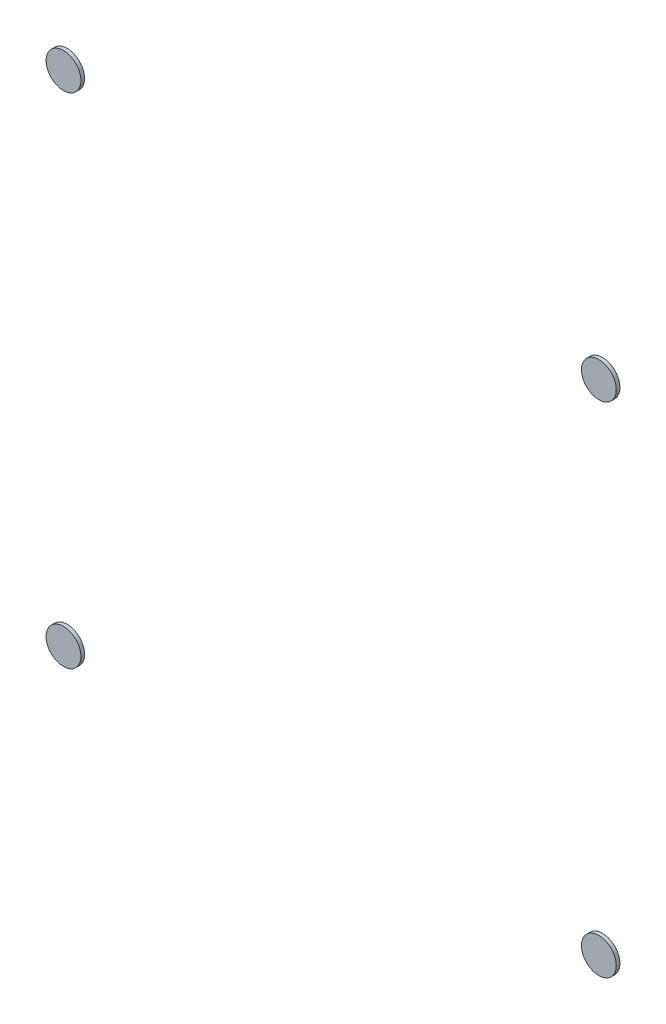
ISO-10303-21;
HEADER;
FILE_DESCRIPTION(('STEP AP214'),'2;1');
FILE_NAME('part.step','',(''),(''),'','','');
FILE_SCHEMA(('AUTOMOTIVE_DESIGN { 1 0 10303 214 1 1 1 1 }'));
ENDSEC;
DATA;
#1=APPLICATION_CONTEXT('core data for automotive mechanical design processes');
#2=APPLICATION_PROTOCOL_DEFINITION('international standard','automotive_design',2000,#1);
#3=PRODUCT_CONTEXT('',#1,'mechanical');
#4=PRODUCT('Part','Part','',(#3));
#5=PRODUCT_RELATED_PRODUCT_CATEGORY('part','',(#4));
#6=PRODUCT_DEFINITION_FORMATION('','',#4);
#7=PRODUCT_DEFINITION_CONTEXT('part definition',#1,'design');
#8=PRODUCT_DEFINITION('design','',#6,#7);
#9=PRODUCT_DEFINITION_SHAPE('','',#8);
#10=(LENGTH_UNIT() NAMED_UNIT(*) SI_UNIT(.MILLI.,.METRE.));
#11=(NAMED_UNIT(*) PLANE_ANGLE_UNIT() SI_UNIT($,.RADIAN.));
#12=(NAMED_UNIT(*) SI_UNIT($,.STERADIAN.) SOLID_ANGLE_UNIT());
#13=UNCERTAINTY_MEASURE_WITH_UNIT(LENGTH_MEASURE(1.E-05),#10,'distance_accuracy_value','');
#14=(GEOMETRIC_REPRESENTATION_CONTEXT(3) GLOBAL_UNCERTAINTY_ASSIGNED_CONTEXT((#13)) GLOBAL_UNIT_ASSIGNED_CONTEXT((#10,
#11,#12)) REPRESENTATION_CONTEXT('',''));
#15=CARTESIAN_POINT('',(0.,0.,0.));
#16=DIRECTION('',(0.,0.,1.));
#17=DIRECTION('',(1.,0.,0.));
#18=AXIS2_PLACEMENT_3D('',#15,#16,#17);
#19=CARTESIAN_POINT('',(-146.,-136.,-49.));
#20=DIRECTION('',(0.,0.,1.));
#21=DIRECTION('',(1.,0.,0.));
#22=AXIS2_PLACEMENT_3D('',#19,#20,#21);
#23=PLANE('',#22);
#24=CARTESIAN_POINT('',(-146.,-136.,-49.));
#25=DIRECTION('',(0.,0.,-1.));
#26=DIRECTION('',(-1.,0.,0.));
#27=AXIS2_PLACEMENT_3D('',#24,#25,#26);
#28=CIRCLE('',#27,9.5);
#29=CARTESIAN_POINT('',(-155.5,-136.,-49.));
#30=VERTEX_POINT('',#29);
#31=EDGE_CURVE('P0_E10',#30,#30,#28,.T.);
#32=ORIENTED_EDGE('',*,*,#31,.F.);
#33=EDGE_LOOP('',(#32));
#34=FACE_BOUND('',#33,.T.);
#35=ADVANCED_FACE('P0_F15',(#34),#23,.T.);
#36=CARTESIAN_POINT('',(-146.,-136.,-51.));
#37=DIRECTION('',(0.,0.,-1.));
#38=DIRECTION('',(-1.,0.,0.));
#39=AXIS2_PLACEMENT_3D('',#36,#37,#38);
#40=PLANE('',#39);
#41=CARTESIAN_POINT('',(-146.,-136.,-51.));
#42=DIRECTION('',(0.,0.,1.));
#43=DIRECTION('',(1.,0.,0.));
#44=AXIS2_PLACEMENT_3D('',#41,#42,#43);
#45=CIRCLE('',#44,9.5);
#46=CARTESIAN_POINT('',(-136.5,-136.,-51.));
#47=VERTEX_POINT('',#46);
#48=EDGE_CURVE('P0_E23',#47,#47,#45,.T.);
#49=ORIENTED_EDGE('',*,*,#48,.F.);
#50=EDGE_LOOP('',(#49));
#51=FACE_BOUND('',#50,.T.);
#52=ADVANCED_FACE('P0_F32',(#51),#40,.T.);
#53=CARTESIAN_POINT('',(-146.,-136.,-51.));
#54=DIRECTION('',(0.,0.,1.));
#55=DIRECTION('',(1.,0.,0.));
#56=AXIS2_PLACEMENT_3D('',#53,#54,#55);
#57=CYLINDRICAL_SURFACE('',#56,9.5);
#58=ORIENTED_EDGE('',*,*,#31,.T.);
#59=EDGE_LOOP('',(#58));
#60=FACE_BOUND('',#59,.T.);
#61=ORIENTED_EDGE('',*,*,#48,.T.);
#62=EDGE_LOOP('',(#61));
#63=FACE_BOUND('',#62,.T.);
#64=ADVANCED_FACE('P0_F17',(#60,#63),#57,.T.);
#65=CLOSED_SHELL('',(#35,#52,#64));
#66=MANIFOLD_SOLID_BREP('P0_B1',#65);
#67=CARTESIAN_POINT('',(-146.,136.,-49.));
#68=DIRECTION('',(0.,0.,1.));
#69=DIRECTION('',(1.,0.,0.));
#70=AXIS2_PLACEMENT_3D('',#67,#68,#69);
#71=PLANE('',#70);
#72=CARTESIAN_POINT('',(-146.,136.,-49.));
#73=DIRECTION('',(0.,0.,-1.));
#74=DIRECTION('',(-1.,0.,0.));
#75=AXIS2_PLACEMENT_3D('',#72,#73,#74);
#76=CIRCLE('',#75,9.5);
#77=CARTESIAN_POINT('',(-155.5,136.,-49.));
#78=VERTEX_POINT('',#77);
#79=EDGE_CURVE('P1_E10',#78,#78,#76,.T.);
#80=ORIENTED_EDGE('',*,*,#79,.F.);
#81=EDGE_LOOP('',(#80));
#82=FACE_BOUND('',#81,.T.);
#83=ADVANCED_FACE('P1_F15',(#82),#71,.T.);
#84=CARTESIAN_POINT('',(-146.,136.,-51.));
#85=DIRECTION('',(0.,0.,-1.));
#86=DIRECTION('',(-1.,0.,0.));
#87=AXIS2_PLACEMENT_3D('',#84,#85,#86);
#88=PLANE('',#87);
#89=CARTESIAN_POINT('',(-146.,136.,-51.));
#90=DIRECTION('',(0.,0.,1.));
#91=DIRECTION('',(1.,0.,0.));
#92=AXIS2_PLACEMENT_3D('',#89,#90,#91);
#93=CIRCLE('',#92,9.5);
#94=CARTESIAN_POINT('',(-136.5,136.,-51.));
#95=VERTEX_POINT('',#94);
#96=EDGE_CURVE('P1_E23',#95,#95,#93,.T.);
#97=ORIENTED_EDGE('',*,*,#96,.F.);
#98=EDGE_LOOP('',(#97));
#99=FACE_BOUND('',#98,.T.);
#100=ADVANCED_FACE('P1_F32',(#99),#88,.T.);
#101=CARTESIAN_POINT('',(-146.,136.,-51.));
#102=DIRECTION('',(0.,0.,1.));
#103=DIRECTION('',(1.,0.,0.));
#104=AXIS2_PLACEMENT_3D('',#101,#102,#103);
#105=CYLINDRICAL_SURFACE('',#104,9.5);
#106=ORIENTED_EDGE('',*,*,#79,.T.);
#107=EDGE_LOOP('',(#106));
#108=FACE_BOUND('',#107,.T.);
#109=ORIENTED_EDGE('',*,*,#96,.T.);
#110=EDGE_LOOP('',(#109));
#111=FACE_BOUND('',#110,.T.);
#112=ADVANCED_FACE('P1_F17',(#108,#111),#105,.T.);
#113=CLOSED_SHELL('',(#83,#100,#112));
#114=MANIFOLD_SOLID_BREP('P1_B1',#113);
#115=CARTESIAN_POINT('',(146.,-136.,-49.));
#116=DIRECTION('',(0.,0.,1.));
#117=DIRECTION('',(1.,0.,0.));
#118=AXIS2_PLACEMENT_3D('',#115,#116,#117);
#119=PLANE('',#118);
#120=CARTESIAN_POINT('',(146.,-136.,-49.));
#121=DIRECTION('',(0.,0.,-1.));
#122=DIRECTION('',(-1.,0.,0.));
#123=AXIS2_PLACEMENT_3D('',#120,#121,#122);
#124=CIRCLE('',#123,9.5);
#125=CARTESIAN_POINT('',(136.5,-136.,-49.));
#126=VERTEX_POINT('',#125);
#127=EDGE_CURVE('P2_E10',#126,#126,#124,.T.);
#128=ORIENTED_EDGE('',*,*,#127,.F.);
#129=EDGE_LOOP('',(#128));
#130=FACE_BOUND('',#129,.T.);
#131=ADVANCED_FACE('P2_F15',(#130),#119,.T.);
#132=CARTESIAN_POINT('',(146.,-136.,-51.));
#133=DIRECTION('',(0.,0.,-1.));
#134=DIRECTION('',(-1.,0.,0.));
#135=AXIS2_PLACEMENT_3D('',#132,#133,#134);
#136=PLANE('',#135);
#137=CARTESIAN_POINT('',(146.,-136.,-51.));
#138=DIRECTION('',(0.,0.,1.));
#139=DIRECTION('',(1.,0.,0.));
#140=AXIS2_PLACEMENT_3D('',#137,#138,#139);
#141=CIRCLE('',#140,9.5);
#142=CARTESIAN_POINT('',(155.5,-136.,-51.));
#143=VERTEX_POINT('',#142);
#144=EDGE_CURVE('P2_E23',#143,#143,#141,.T.);
#145=ORIENTED_EDGE('',*,*,#144,.F.);
#146=EDGE_LOOP('',(#145));
#147=FACE_BOUND('',#146,.T.);
#148=ADVANCED_FACE('P2_F32',(#147),#136,.T.);
#149=CARTESIAN_POINT('',(146.,-136.,-51.));
#150=DIRECTION('',(0.,0.,1.));
#151=DIRECTION('',(1.,0.,0.));
#152=AXIS2_PLACEMENT_3D('',#149,#150,#151);
#153=CYLINDRICAL_SURFACE('',#152,9.5);
#154=ORIENTED_EDGE('',*,*,#127,.T.);
#155=EDGE_LOOP('',(#154));
#156=FACE_BOUND('',#155,.T.);
#157=ORIENTED_EDGE('',*,*,#144,.T.);
#158=EDGE_LOOP('',(#157));
#159=FACE_BOUND('',#158,.T.);
#160=ADVANCED_FACE('P2_F17',(#156,#159),#153,.T.);
#161=CLOSED_SHELL('',(#131,#148,#160));
#162=MANIFOLD_SOLID_BREP('P2_B1',#161);
#163=CARTESIAN_POINT('',(146.,136.,-49.));
#164=DIRECTION('',(0.,0.,1.));
#165=DIRECTION('',(1.,0.,0.));
#166=AXIS2_PLACEMENT_3D('',#163,#164,#165);
#167=PLANE('',#166);
#168=CARTESIAN_POINT('',(146.,136.,-49.));
#169=DIRECTION('',(0.,0.,-1.));
#170=DIRECTION('',(-1.,0.,0.));
#171=AXIS2_PLACEMENT_3D('',#168,#169,#170);
#172=CIRCLE('',#171,9.5);
#173=CARTESIAN_POINT('',(136.5,136.,-49.));
#174=VERTEX_POINT('',#173);
#175=EDGE_CURVE('P3_E10',#174,#174,#172,.T.);
#176=ORIENTED_EDGE('',*,*,#175,.F.);
#177=EDGE_LOOP('',(#176));
#178=FACE_BOUND('',#177,.T.);
#179=ADVANCED_FACE('P3_F15',(#178),#167,.T.);
#180=CARTESIAN_POINT('',(146.,136.,-51.));
#181=DIRECTION('',(0.,0.,-1.));
#182=DIRECTION('',(-1.,0.,0.));
#183=AXIS2_PLACEMENT_3D('',#180,#181,#182);
#184=PLANE('',#183);
#185=CARTESIAN_POINT('',(146.,136.,-51.));
#186=DIRECTION('',(0.,0.,1.));
#187=DIRECTION('',(1.,0.,0.));
#188=AXIS2_PLACEMENT_3D('',#185,#186,#187);
#189=CIRCLE('',#188,9.5);
#190=CARTESIAN_POINT('',(155.5,136.,-51.));
#191=VERTEX_POINT('',#190);
#192=EDGE_CURVE('P3_E23',#191,#191,#189,.T.);
#193=ORIENTED_EDGE('',*,*,#192,.F.);
#194=EDGE_LOOP('',(#193));
#195=FACE_BOUND('',#194,.T.);
#196=ADVANCED_FACE('P3_F32',(#195),#184,.T.);
#197=CARTESIAN_POINT('',(146.,136.,-51.));
#198=DIRECTION('',(0.,0.,1.));
#199=DIRECTION('',(1.,0.,0.));
#200=AXIS2_PLACEMENT_3D('',#197,#198,#199);
#201=CYLINDRICAL_SURFACE('',#200,9.5);
#202=ORIENTED_EDGE('',*,*,#175,.T.);
#203=EDGE_LOOP('',(#202));
#204=FACE_BOUND('',#203,.T.);
#205=ORIENTED_EDGE('',*,*,#192,.T.);
#206=EDGE_LOOP('',(#205));
#207=FACE_BOUND('',#206,.T.);
#208=ADVANCED_FACE('P3_F17',(#204,#207),#201,.T.);
#209=CLOSED_SHELL('',(#179,#196,#208));
#210=MANIFOLD_SOLID_BREP('P3_B1',#209);
#211=ADVANCED_BREP_SHAPE_REPRESENTATION('',(#18,#66,#114,#162,#210),#14);
#212=SHAPE_DEFINITION_REPRESENTATION(#9,#211);
ENDSEC;
END-ISO-10303-21;
